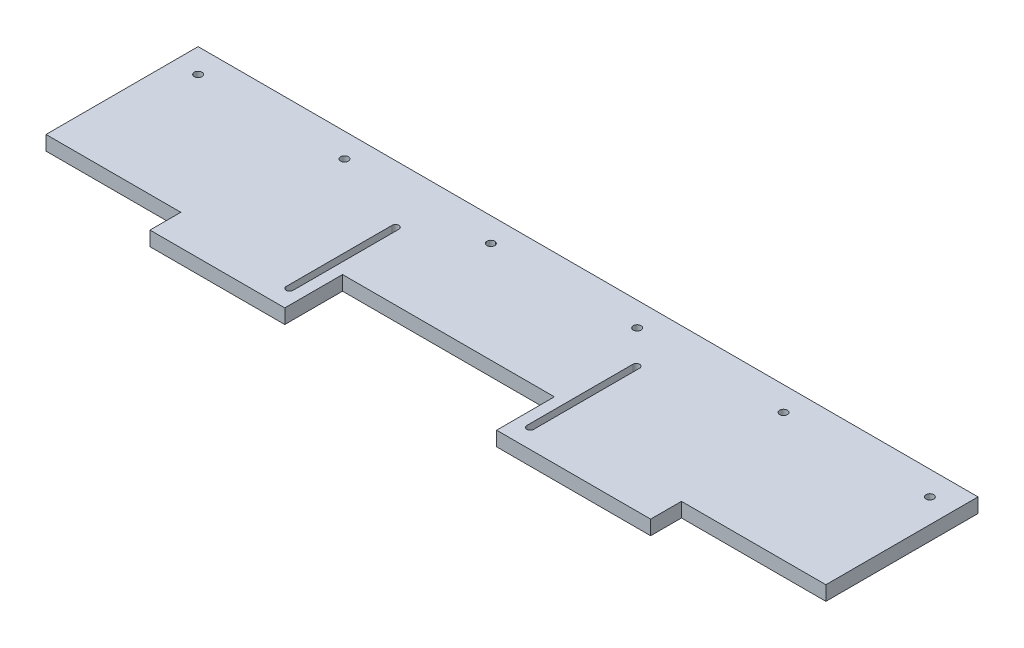
ISO-10303-21;
HEADER;
FILE_DESCRIPTION(('STEP AP214'),'2;1');
FILE_NAME('part.step','',(''),(''),'','','');
FILE_SCHEMA(('AUTOMOTIVE_DESIGN { 1 0 10303 214 1 1 1 1 }'));
ENDSEC;
DATA;
#1=APPLICATION_CONTEXT('core data for automotive mechanical design processes');
#2=APPLICATION_PROTOCOL_DEFINITION('international standard','automotive_design',2000,#1);
#3=PRODUCT_CONTEXT('',#1,'mechanical');
#4=PRODUCT('Part','Part','',(#3));
#5=PRODUCT_RELATED_PRODUCT_CATEGORY('part','',(#4));
#6=PRODUCT_DEFINITION_FORMATION('','',#4);
#7=PRODUCT_DEFINITION_CONTEXT('part definition',#1,'design');
#8=PRODUCT_DEFINITION('design','',#6,#7);
#9=PRODUCT_DEFINITION_SHAPE('','',#8);
#10=(LENGTH_UNIT() NAMED_UNIT(*) SI_UNIT(.MILLI.,.METRE.));
#11=(NAMED_UNIT(*) PLANE_ANGLE_UNIT() SI_UNIT($,.RADIAN.));
#12=(NAMED_UNIT(*) SI_UNIT($,.STERADIAN.) SOLID_ANGLE_UNIT());
#13=UNCERTAINTY_MEASURE_WITH_UNIT(LENGTH_MEASURE(1.E-05),#10,'distance_accuracy_value','');
#14=(GEOMETRIC_REPRESENTATION_CONTEXT(3) GLOBAL_UNCERTAINTY_ASSIGNED_CONTEXT((#13)) GLOBAL_UNIT_ASSIGNED_CONTEXT((#10,
#11,#12)) REPRESENTATION_CONTEXT('',''));
#15=CARTESIAN_POINT('',(0.,0.,0.));
#16=DIRECTION('',(0.,0.,1.));
#17=DIRECTION('',(1.,0.,0.));
#18=AXIS2_PLACEMENT_3D('',#15,#16,#17);
#19=CARTESIAN_POINT('',(-241.3,4.7625,-12.7));
#20=DIRECTION('',(0.,1.,0.));
#21=DIRECTION('',(0.,0.,1.));
#22=AXIS2_PLACEMENT_3D('',#19,#20,#21);
#23=CYLINDRICAL_SURFACE('',#22,2.55269999999999);
#24=CARTESIAN_POINT('',(-241.3,-4.7625,-12.7));
#25=DIRECTION('',(0.,1.,0.));
#26=DIRECTION('',(0.,0.,1.));
#27=AXIS2_PLACEMENT_3D('',#24,#25,#26);
#28=CIRCLE('',#27,2.55269999999999);
#29=CARTESIAN_POINT('',(-241.3,-4.7625,-10.1473));
#30=VERTEX_POINT('',#29);
#31=EDGE_CURVE('E108',#30,#30,#28,.T.);
#32=ORIENTED_EDGE('',*,*,#31,.F.);
#33=EDGE_LOOP('',(#32));
#34=FACE_BOUND('',#33,.T.);
#35=CARTESIAN_POINT('',(-241.3,4.7625,-12.7));
#36=DIRECTION('',(0.,1.,0.));
#37=DIRECTION('',(0.,0.,1.));
#38=AXIS2_PLACEMENT_3D('',#35,#36,#37);
#39=CIRCLE('',#38,2.55269999999999);
#40=CARTESIAN_POINT('',(-241.3,4.7625,-10.1473));
#41=VERTEX_POINT('',#40);
#42=EDGE_CURVE('E12',#41,#41,#39,.T.);
#43=ORIENTED_EDGE('',*,*,#42,.T.);
#44=EDGE_LOOP('',(#43));
#45=FACE_BOUND('',#44,.T.);
#46=ADVANCED_FACE('F100',(#34,#45),#23,.F.);
#47=CARTESIAN_POINT('',(-144.78,4.7625,-12.7));
#48=DIRECTION('',(0.,1.,0.));
#49=DIRECTION('',(0.,0.,1.));
#50=AXIS2_PLACEMENT_3D('',#47,#48,#49);
#51=CYLINDRICAL_SURFACE('',#50,2.55269999999999);
#52=CARTESIAN_POINT('',(-144.78,-4.7625,-12.7));
#53=DIRECTION('',(0.,1.,0.));
#54=DIRECTION('',(0.,0.,1.));
#55=AXIS2_PLACEMENT_3D('',#52,#53,#54);
#56=CIRCLE('',#55,2.55269999999999);
#57=CARTESIAN_POINT('',(-144.78,-4.7625,-10.1473));
#58=VERTEX_POINT('',#57);
#59=EDGE_CURVE('E487',#58,#58,#56,.T.);
#60=ORIENTED_EDGE('',*,*,#59,.F.);
#61=EDGE_LOOP('',(#60));
#62=FACE_BOUND('',#61,.T.);
#63=CARTESIAN_POINT('',(-144.78,4.7625,-12.7));
#64=DIRECTION('',(0.,1.,0.));
#65=DIRECTION('',(0.,0.,1.));
#66=AXIS2_PLACEMENT_3D('',#63,#64,#65);
#67=CIRCLE('',#66,2.55269999999999);
#68=CARTESIAN_POINT('',(-144.78,4.7625,-10.1473));
#69=VERTEX_POINT('',#68);
#70=EDGE_CURVE('E491',#69,#69,#67,.T.);
#71=ORIENTED_EDGE('',*,*,#70,.T.);
#72=EDGE_LOOP('',(#71));
#73=FACE_BOUND('',#72,.T.);
#74=ADVANCED_FACE('F501',(#62,#73),#51,.F.);
#75=CARTESIAN_POINT('',(-48.26,4.7625,-12.7));
#76=DIRECTION('',(0.,1.,0.));
#77=DIRECTION('',(0.,0.,1.));
#78=AXIS2_PLACEMENT_3D('',#75,#76,#77);
#79=CYLINDRICAL_SURFACE('',#78,2.55269999999999);
#80=CARTESIAN_POINT('',(-48.26,-4.7625,-12.7));
#81=DIRECTION('',(0.,1.,0.));
#82=DIRECTION('',(0.,0.,1.));
#83=AXIS2_PLACEMENT_3D('',#80,#81,#82);
#84=CIRCLE('',#83,2.55269999999999);
#85=CARTESIAN_POINT('',(-48.26,-4.7625,-10.1473));
#86=VERTEX_POINT('',#85);
#87=EDGE_CURVE('E479',#86,#86,#84,.T.);
#88=ORIENTED_EDGE('',*,*,#87,.F.);
#89=EDGE_LOOP('',(#88));
#90=FACE_BOUND('',#89,.T.);
#91=CARTESIAN_POINT('',(-48.26,4.7625,-12.7));
#92=DIRECTION('',(0.,1.,0.));
#93=DIRECTION('',(0.,0.,1.));
#94=AXIS2_PLACEMENT_3D('',#91,#92,#93);
#95=CIRCLE('',#94,2.55269999999999);
#96=CARTESIAN_POINT('',(-48.26,4.7625,-10.1473));
#97=VERTEX_POINT('',#96);
#98=EDGE_CURVE('E483',#97,#97,#95,.T.);
#99=ORIENTED_EDGE('',*,*,#98,.T.);
#100=EDGE_LOOP('',(#99));
#101=FACE_BOUND('',#100,.T.);
#102=ADVANCED_FACE('F525',(#90,#101),#79,.F.);
#103=CARTESIAN_POINT('',(48.26,4.7625,-12.7));
#104=DIRECTION('',(0.,1.,0.));
#105=DIRECTION('',(0.,0.,1.));
#106=AXIS2_PLACEMENT_3D('',#103,#104,#105);
#107=CYLINDRICAL_SURFACE('',#106,2.55269999999999);
#108=CARTESIAN_POINT('',(48.26,-4.7625,-12.7));
#109=DIRECTION('',(0.,1.,0.));
#110=DIRECTION('',(0.,0.,1.));
#111=AXIS2_PLACEMENT_3D('',#108,#109,#110);
#112=CIRCLE('',#111,2.55269999999999);
#113=CARTESIAN_POINT('',(48.26,-4.7625,-10.1473));
#114=VERTEX_POINT('',#113);
#115=EDGE_CURVE('E469',#114,#114,#112,.T.);
#116=ORIENTED_EDGE('',*,*,#115,.F.);
#117=EDGE_LOOP('',(#116));
#118=FACE_BOUND('',#117,.T.);
#119=CARTESIAN_POINT('',(48.26,4.7625,-12.7));
#120=DIRECTION('',(0.,1.,0.));
#121=DIRECTION('',(0.,0.,1.));
#122=AXIS2_PLACEMENT_3D('',#119,#120,#121);
#123=CIRCLE('',#122,2.55269999999999);
#124=CARTESIAN_POINT('',(48.26,4.7625,-10.1473));
#125=VERTEX_POINT('',#124);
#126=EDGE_CURVE('E475',#125,#125,#123,.T.);
#127=ORIENTED_EDGE('',*,*,#126,.T.);
#128=EDGE_LOOP('',(#127));
#129=FACE_BOUND('',#128,.T.);
#130=ADVANCED_FACE('F516',(#118,#129),#107,.F.);
#131=CARTESIAN_POINT('',(0.,4.7625,-28.575));
#132=DIRECTION('',(0.,0.,-1.));
#133=DIRECTION('',(-1.,0.,0.));
#134=AXIS2_PLACEMENT_3D('',#131,#132,#133);
#135=PLANE('',#134);
#136=DIRECTION('',(1.,0.,0.));
#137=VECTOR('',#136,1.);
#138=CARTESIAN_POINT('',(0.,-4.7625,-28.575));
#139=LINE('',#138,#137);
#140=CARTESIAN_POINT('',(-257.175,-4.7625,-28.575));
#141=VERTEX_POINT('',#140);
#142=CARTESIAN_POINT('',(257.175,-4.7625,-28.575));
#143=VERTEX_POINT('',#142);
#144=EDGE_CURVE('E430',#141,#143,#139,.T.);
#145=ORIENTED_EDGE('',*,*,#144,.F.);
#146=DIRECTION('',(0.,-1.,0.));
#147=VECTOR('',#146,1.);
#148=CARTESIAN_POINT('',(-257.175,4.7625,-28.575));
#149=LINE('',#148,#147);
#150=CARTESIAN_POINT('',(-257.175,4.7625,-28.575));
#151=VERTEX_POINT('',#150);
#152=EDGE_CURVE('E360',#151,#141,#149,.T.);
#153=ORIENTED_EDGE('',*,*,#152,.F.);
#154=DIRECTION('',(1.,0.,0.));
#155=VECTOR('',#154,1.);
#156=CARTESIAN_POINT('',(0.,4.7625,-28.575));
#157=LINE('',#156,#155);
#158=CARTESIAN_POINT('',(257.175,4.7625,-28.575));
#159=VERTEX_POINT('',#158);
#160=EDGE_CURVE('E466',#151,#159,#157,.T.);
#161=ORIENTED_EDGE('',*,*,#160,.T.);
#162=DIRECTION('',(0.,-1.,0.));
#163=VECTOR('',#162,1.);
#164=CARTESIAN_POINT('',(257.175,4.7625,-28.575));
#165=LINE('',#164,#163);
#166=EDGE_CURVE('E344',#159,#143,#165,.T.);
#167=ORIENTED_EDGE('',*,*,#166,.T.);
#168=EDGE_LOOP('',(#145,#153,#161,#167));
#169=FACE_BOUND('',#168,.T.);
#170=ADVANCED_FACE('F506',(#169),#135,.T.);
#171=CARTESIAN_POINT('',(0.,4.7625,0.));
#172=DIRECTION('',(0.,1.,0.));
#173=DIRECTION('',(0.,0.,1.));
#174=AXIS2_PLACEMENT_3D('',#171,#172,#173);
#175=PLANE('',#174);
#176=CARTESIAN_POINT('',(-88.9,4.7625,79.375));
#177=DIRECTION('',(0.,1.,0.));
#178=DIRECTION('',(0.,0.,1.));
#179=AXIS2_PLACEMENT_3D('',#176,#177,#178);
#180=CIRCLE('',#179,2.2479);
#181=CARTESIAN_POINT('',(-91.1479,4.7625,79.375));
#182=VERTEX_POINT('',#181);
#183=CARTESIAN_POINT('',(-86.6521,4.7625,79.375));
#184=VERTEX_POINT('',#183);
#185=EDGE_CURVE('E115',#182,#184,#180,.T.);
#186=ORIENTED_EDGE('',*,*,#185,.F.);
#187=DIRECTION('',(0.,0.,1.));
#188=VECTOR('',#187,1.);
#189=CARTESIAN_POINT('',(-91.1479,4.7625,79.375));
#190=LINE('',#189,#188);
#191=CARTESIAN_POINT('',(-91.1479,4.7625,9.52500000000002));
#192=VERTEX_POINT('',#191);
#193=EDGE_CURVE('E246',#192,#182,#190,.T.);
#194=ORIENTED_EDGE('',*,*,#193,.F.);
#195=CARTESIAN_POINT('',(-88.9,4.7625,9.52500000000002));
#196=DIRECTION('',(0.,1.,0.));
#197=DIRECTION('',(0.,0.,1.));
#198=AXIS2_PLACEMENT_3D('',#195,#196,#197);
#199=CIRCLE('',#198,2.2479);
#200=CARTESIAN_POINT('',(-86.6521,4.7625,9.52500000000002));
#201=VERTEX_POINT('',#200);
#202=EDGE_CURVE('E274',#201,#192,#199,.T.);
#203=ORIENTED_EDGE('',*,*,#202,.F.);
#204=DIRECTION('',(0.,0.,-1.));
#205=VECTOR('',#204,1.);
#206=CARTESIAN_POINT('',(-86.6521,4.7625,79.375));
#207=LINE('',#206,#205);
#208=EDGE_CURVE('E266',#184,#201,#207,.T.);
#209=ORIENTED_EDGE('',*,*,#208,.F.);
#210=EDGE_LOOP('',(#186,#194,#203,#209));
#211=FACE_BOUND('',#210,.T.);
#212=CARTESIAN_POINT('',(69.85,4.7625,79.375));
#213=DIRECTION('',(0.,1.,0.));
#214=DIRECTION('',(0.,0.,1.));
#215=AXIS2_PLACEMENT_3D('',#212,#213,#214);
#216=CIRCLE('',#215,2.2479);
#217=CARTESIAN_POINT('',(67.6021,4.7625,79.375));
#218=VERTEX_POINT('',#217);
#219=CARTESIAN_POINT('',(72.0979,4.7625,79.375));
#220=VERTEX_POINT('',#219);
#221=EDGE_CURVE('E123',#218,#220,#216,.T.);
#222=ORIENTED_EDGE('',*,*,#221,.F.);
#223=DIRECTION('',(0.,0.,1.));
#224=VECTOR('',#223,1.);
#225=CARTESIAN_POINT('',(67.6021,4.7625,79.375));
#226=LINE('',#225,#224);
#227=CARTESIAN_POINT('',(67.6021,4.7625,9.52499999999999));
#228=VERTEX_POINT('',#227);
#229=EDGE_CURVE('E309',#228,#218,#226,.T.);
#230=ORIENTED_EDGE('',*,*,#229,.F.);
#231=CARTESIAN_POINT('',(69.85,4.7625,9.52499999999999));
#232=DIRECTION('',(0.,1.,0.));
#233=DIRECTION('',(0.,0.,1.));
#234=AXIS2_PLACEMENT_3D('',#231,#232,#233);
#235=CIRCLE('',#234,2.2479);
#236=CARTESIAN_POINT('',(72.0979,4.7625,9.52499999999999));
#237=VERTEX_POINT('',#236);
#238=EDGE_CURVE('E305',#237,#228,#235,.T.);
#239=ORIENTED_EDGE('',*,*,#238,.F.);
#240=DIRECTION('',(0.,0.,-1.));
#241=VECTOR('',#240,1.);
#242=CARTESIAN_POINT('',(72.0979,4.7625,79.375));
#243=LINE('',#242,#241);
#244=EDGE_CURVE('E301',#220,#237,#243,.T.);
#245=ORIENTED_EDGE('',*,*,#244,.F.);
#246=EDGE_LOOP('',(#222,#230,#239,#245));
#247=FACE_BOUND('',#246,.T.);
#248=CARTESIAN_POINT('',(144.78,4.7625,-12.7));
#249=DIRECTION('',(0.,1.,0.));
#250=DIRECTION('',(0.,0.,1.));
#251=AXIS2_PLACEMENT_3D('',#248,#249,#250);
#252=CIRCLE('',#251,2.55269999999999);
#253=CARTESIAN_POINT('',(144.78,4.7625,-10.1473));
#254=VERTEX_POINT('',#253);
#255=EDGE_CURVE('E332',#254,#254,#252,.T.);
#256=ORIENTED_EDGE('',*,*,#255,.F.);
#257=EDGE_LOOP('',(#256));
#258=FACE_BOUND('',#257,.T.);
#259=CARTESIAN_POINT('',(241.3,4.7625,-12.7));
#260=DIRECTION('',(0.,1.,0.));
#261=DIRECTION('',(0.,0.,1.));
#262=AXIS2_PLACEMENT_3D('',#259,#260,#261);
#263=CIRCLE('',#262,2.55269999999999);
#264=CARTESIAN_POINT('',(241.3,4.7625,-10.1473));
#265=VERTEX_POINT('',#264);
#266=EDGE_CURVE('E336',#265,#265,#263,.T.);
#267=ORIENTED_EDGE('',*,*,#266,.F.);
#268=EDGE_LOOP('',(#267));
#269=FACE_BOUND('',#268,.T.);
#270=ORIENTED_EDGE('',*,*,#160,.F.);
#271=DIRECTION('',(0.,0.,-1.));
#272=VECTOR('',#271,1.);
#273=CARTESIAN_POINT('',(-257.175,4.7625,71.755));
#274=LINE('',#273,#272);
#275=CARTESIAN_POINT('',(-257.175,4.7625,71.755));
#276=VERTEX_POINT('',#275);
#277=EDGE_CURVE('E372',#276,#151,#274,.T.);
#278=ORIENTED_EDGE('',*,*,#277,.F.);
#279=DIRECTION('',(-1.,0.,0.));
#280=VECTOR('',#279,1.);
#281=CARTESIAN_POINT('',(0.,4.7625,71.755));
#282=LINE('',#281,#280);
#283=CARTESIAN_POINT('',(-168.275,4.7625,71.755));
#284=VERTEX_POINT('',#283);
#285=EDGE_CURVE('E377',#284,#276,#282,.T.);
#286=ORIENTED_EDGE('',*,*,#285,.F.);
#287=DIRECTION('',(0.,0.,1.));
#288=VECTOR('',#287,1.);
#289=CARTESIAN_POINT('',(-168.275,4.7625,0.));
#290=LINE('',#289,#288);
#291=CARTESIAN_POINT('',(-168.275,4.7625,92.075));
#292=VERTEX_POINT('',#291);
#293=EDGE_CURVE('E380',#284,#292,#290,.T.);
#294=ORIENTED_EDGE('',*,*,#293,.T.);
#295=DIRECTION('',(-1.,0.,0.));
#296=VECTOR('',#295,1.);
#297=CARTESIAN_POINT('',(0.,4.7625,92.075));
#298=LINE('',#297,#296);
#299=CARTESIAN_POINT('',(-79.375,4.7625,92.075));
#300=VERTEX_POINT('',#299);
#301=EDGE_CURVE('E384',#300,#292,#298,.T.);
#302=ORIENTED_EDGE('',*,*,#301,.F.);
#303=DIRECTION('',(0.,0.,1.));
#304=VECTOR('',#303,1.);
#305=CARTESIAN_POINT('',(-79.375,4.7625,0.));
#306=LINE('',#305,#304);
#307=CARTESIAN_POINT('',(-79.375,4.7625,53.975));
#308=VERTEX_POINT('',#307);
#309=EDGE_CURVE('E388',#308,#300,#306,.T.);
#310=ORIENTED_EDGE('',*,*,#309,.F.);
#311=DIRECTION('',(1.,0.,0.));
#312=VECTOR('',#311,1.);
#313=CARTESIAN_POINT('',(0.,4.7625,53.975));
#314=LINE('',#313,#312);
#315=CARTESIAN_POINT('',(60.325,4.7625,53.975));
#316=VERTEX_POINT('',#315);
#317=EDGE_CURVE('E392',#308,#316,#314,.T.);
#318=ORIENTED_EDGE('',*,*,#317,.T.);
#319=DIRECTION('',(0.,0.,1.));
#320=VECTOR('',#319,1.);
#321=CARTESIAN_POINT('',(60.325,4.7625,28.575));
#322=LINE('',#321,#320);
#323=CARTESIAN_POINT('',(60.325,4.7625,92.075));
#324=VERTEX_POINT('',#323);
#325=EDGE_CURVE('E440',#316,#324,#322,.T.);
#326=ORIENTED_EDGE('',*,*,#325,.T.);
#327=DIRECTION('',(-1.,0.,0.));
#328=VECTOR('',#327,1.);
#329=CARTESIAN_POINT('',(161.925,4.7625,92.075));
#330=LINE('',#329,#328);
#331=CARTESIAN_POINT('',(161.925,4.7625,92.075));
#332=VERTEX_POINT('',#331);
#333=EDGE_CURVE('E443',#332,#324,#330,.T.);
#334=ORIENTED_EDGE('',*,*,#333,.F.);
#335=DIRECTION('',(0.,0.,1.));
#336=VECTOR('',#335,1.);
#337=CARTESIAN_POINT('',(161.925,4.7625,28.575));
#338=LINE('',#337,#336);
#339=CARTESIAN_POINT('',(161.925,4.7625,71.755));
#340=VERTEX_POINT('',#339);
#341=EDGE_CURVE('E448',#340,#332,#338,.T.);
#342=ORIENTED_EDGE('',*,*,#341,.F.);
#343=DIRECTION('',(1.,0.,0.));
#344=VECTOR('',#343,1.);
#345=CARTESIAN_POINT('',(0.,4.7625,71.755));
#346=LINE('',#345,#344);
#347=CARTESIAN_POINT('',(257.175,4.7625,71.755));
#348=VERTEX_POINT('',#347);
#349=EDGE_CURVE('E431',#340,#348,#346,.T.);
#350=ORIENTED_EDGE('',*,*,#349,.T.);
#351=DIRECTION('',(0.,0.,-1.));
#352=VECTOR('',#351,1.);
#353=CARTESIAN_POINT('',(257.175,4.7625,71.755));
#354=LINE('',#353,#352);
#355=EDGE_CURVE('E348',#348,#159,#354,.T.);
#356=ORIENTED_EDGE('',*,*,#355,.T.);
#357=EDGE_LOOP('',(#270,#278,#286,#294,#302,#310,#318,#326,#334,#342,#350,#356));
#358=FACE_BOUND('',#357,.T.);
#359=ORIENTED_EDGE('',*,*,#126,.F.);
#360=EDGE_LOOP('',(#359));
#361=FACE_BOUND('',#360,.T.);
#362=ORIENTED_EDGE('',*,*,#98,.F.);
#363=EDGE_LOOP('',(#362));
#364=FACE_BOUND('',#363,.T.);
#365=ORIENTED_EDGE('',*,*,#70,.F.);
#366=EDGE_LOOP('',(#365));
#367=FACE_BOUND('',#366,.T.);
#368=ORIENTED_EDGE('',*,*,#42,.F.);
#369=EDGE_LOOP('',(#368));
#370=FACE_BOUND('',#369,.T.);
#371=ADVANCED_FACE('F504',(#211,#247,#258,#269,#358,#361,#364,#367,#370),#175,.T.);
#372=CARTESIAN_POINT('',(0.,-4.7625,0.));
#373=DIRECTION('',(0.,1.,0.));
#374=DIRECTION('',(0.,0.,1.));
#375=AXIS2_PLACEMENT_3D('',#372,#373,#374);
#376=PLANE('',#375);
#377=DIRECTION('',(0.,0.,-1.));
#378=VECTOR('',#377,1.);
#379=CARTESIAN_POINT('',(-91.1479,-4.7625,79.375));
#380=LINE('',#379,#378);
#381=CARTESIAN_POINT('',(-91.1479,-4.7625,79.375));
#382=VERTEX_POINT('',#381);
#383=CARTESIAN_POINT('',(-91.1479,-4.7625,9.52500000000002));
#384=VERTEX_POINT('',#383);
#385=EDGE_CURVE('E261',#382,#384,#380,.T.);
#386=ORIENTED_EDGE('',*,*,#385,.F.);
#387=CARTESIAN_POINT('',(-88.9,-4.7625,79.375));
#388=DIRECTION('',(0.,1.,0.));
#389=DIRECTION('',(0.,0.,1.));
#390=AXIS2_PLACEMENT_3D('',#387,#388,#389);
#391=CIRCLE('',#390,2.2479);
#392=CARTESIAN_POINT('',(-86.6521,-4.7625,79.375));
#393=VERTEX_POINT('',#392);
#394=EDGE_CURVE('E239',#393,#382,#391,.F.);
#395=ORIENTED_EDGE('',*,*,#394,.F.);
#396=DIRECTION('',(0.,0.,1.));
#397=VECTOR('',#396,1.);
#398=CARTESIAN_POINT('',(-86.6521,-4.7625,79.375));
#399=LINE('',#398,#397);
#400=CARTESIAN_POINT('',(-86.6521,-4.7625,9.52500000000002));
#401=VERTEX_POINT('',#400);
#402=EDGE_CURVE('E250',#401,#393,#399,.T.);
#403=ORIENTED_EDGE('',*,*,#402,.F.);
#404=CARTESIAN_POINT('',(-88.9,-4.7625,9.52500000000002));
#405=DIRECTION('',(0.,1.,0.));
#406=DIRECTION('',(0.,0.,1.));
#407=AXIS2_PLACEMENT_3D('',#404,#405,#406);
#408=CIRCLE('',#407,2.2479);
#409=EDGE_CURVE('E268',#384,#401,#408,.F.);
#410=ORIENTED_EDGE('',*,*,#409,.F.);
#411=EDGE_LOOP('',(#386,#395,#403,#410));
#412=FACE_BOUND('',#411,.T.);
#413=DIRECTION('',(0.,0.,-1.));
#414=VECTOR('',#413,1.);
#415=CARTESIAN_POINT('',(67.6021,-4.7625,79.375));
#416=LINE('',#415,#414);
#417=CARTESIAN_POINT('',(67.6021,-4.7625,79.375));
#418=VERTEX_POINT('',#417);
#419=CARTESIAN_POINT('',(67.6021,-4.7625,9.52499999999999));
#420=VERTEX_POINT('',#419);
#421=EDGE_CURVE('E291',#418,#420,#416,.T.);
#422=ORIENTED_EDGE('',*,*,#421,.F.);
#423=CARTESIAN_POINT('',(69.85,-4.7625,79.375));
#424=DIRECTION('',(0.,1.,0.));
#425=DIRECTION('',(0.,0.,1.));
#426=AXIS2_PLACEMENT_3D('',#423,#424,#425);
#427=CIRCLE('',#426,2.2479);
#428=CARTESIAN_POINT('',(72.0979,-4.7625,79.375));
#429=VERTEX_POINT('',#428);
#430=EDGE_CURVE('E295',#429,#418,#427,.F.);
#431=ORIENTED_EDGE('',*,*,#430,.F.);
#432=DIRECTION('',(0.,0.,1.));
#433=VECTOR('',#432,1.);
#434=CARTESIAN_POINT('',(72.0979,-4.7625,79.375));
#435=LINE('',#434,#433);
#436=CARTESIAN_POINT('',(72.0979,-4.7625,9.52499999999999));
#437=VERTEX_POINT('',#436);
#438=EDGE_CURVE('E317',#437,#429,#435,.T.);
#439=ORIENTED_EDGE('',*,*,#438,.F.);
#440=CARTESIAN_POINT('',(69.85,-4.7625,9.52499999999999));
#441=DIRECTION('',(0.,1.,0.));
#442=DIRECTION('',(0.,0.,1.));
#443=AXIS2_PLACEMENT_3D('',#440,#441,#442);
#444=CIRCLE('',#443,2.2479);
#445=EDGE_CURVE('E288',#420,#437,#444,.F.);
#446=ORIENTED_EDGE('',*,*,#445,.F.);
#447=EDGE_LOOP('',(#422,#431,#439,#446));
#448=FACE_BOUND('',#447,.T.);
#449=CARTESIAN_POINT('',(144.78,-4.7625,-12.7));
#450=DIRECTION('',(0.,1.,0.));
#451=DIRECTION('',(0.,0.,1.));
#452=AXIS2_PLACEMENT_3D('',#449,#450,#451);
#453=CIRCLE('',#452,2.55269999999999);
#454=CARTESIAN_POINT('',(144.78,-4.7625,-10.1473));
#455=VERTEX_POINT('',#454);
#456=EDGE_CURVE('E255',#455,#455,#453,.T.);
#457=ORIENTED_EDGE('',*,*,#456,.T.);
#458=EDGE_LOOP('',(#457));
#459=FACE_BOUND('',#458,.T.);
#460=CARTESIAN_POINT('',(241.3,-4.7625,-12.7));
#461=DIRECTION('',(0.,1.,0.));
#462=DIRECTION('',(0.,0.,1.));
#463=AXIS2_PLACEMENT_3D('',#460,#461,#462);
#464=CIRCLE('',#463,2.55269999999999);
#465=CARTESIAN_POINT('',(241.3,-4.7625,-10.1473));
#466=VERTEX_POINT('',#465);
#467=EDGE_CURVE('E340',#466,#466,#464,.T.);
#468=ORIENTED_EDGE('',*,*,#467,.T.);
#469=EDGE_LOOP('',(#468));
#470=FACE_BOUND('',#469,.T.);
#471=ORIENTED_EDGE('',*,*,#144,.T.);
#472=DIRECTION('',(0.,0.,1.));
#473=VECTOR('',#472,1.);
#474=CARTESIAN_POINT('',(257.175,-4.7625,-28.575));
#475=LINE('',#474,#473);
#476=CARTESIAN_POINT('',(257.175,-4.7625,71.755));
#477=VERTEX_POINT('',#476);
#478=EDGE_CURVE('E356',#143,#477,#475,.T.);
#479=ORIENTED_EDGE('',*,*,#478,.T.);
#480=DIRECTION('',(1.,0.,0.));
#481=VECTOR('',#480,1.);
#482=CARTESIAN_POINT('',(0.,-4.7625,71.755));
#483=LINE('',#482,#481);
#484=CARTESIAN_POINT('',(161.925,-4.7625,71.755));
#485=VERTEX_POINT('',#484);
#486=EDGE_CURVE('E434',#485,#477,#483,.T.);
#487=ORIENTED_EDGE('',*,*,#486,.F.);
#488=DIRECTION('',(0.,0.,1.));
#489=VECTOR('',#488,1.);
#490=CARTESIAN_POINT('',(161.925,-4.7625,28.575));
#491=LINE('',#490,#489);
#492=CARTESIAN_POINT('',(161.925,-4.7625,92.075));
#493=VERTEX_POINT('',#492);
#494=EDGE_CURVE('E444',#485,#493,#491,.T.);
#495=ORIENTED_EDGE('',*,*,#494,.T.);
#496=DIRECTION('',(-1.,0.,0.));
#497=VECTOR('',#496,1.);
#498=CARTESIAN_POINT('',(161.925,-4.7625,92.075));
#499=LINE('',#498,#497);
#500=CARTESIAN_POINT('',(60.325,-4.7625,92.075));
#501=VERTEX_POINT('',#500);
#502=EDGE_CURVE('E454',#493,#501,#499,.T.);
#503=ORIENTED_EDGE('',*,*,#502,.T.);
#504=DIRECTION('',(0.,0.,1.));
#505=VECTOR('',#504,1.);
#506=CARTESIAN_POINT('',(60.325,-4.7625,28.575));
#507=LINE('',#506,#505);
#508=CARTESIAN_POINT('',(60.325,-4.7625,53.975));
#509=VERTEX_POINT('',#508);
#510=EDGE_CURVE('E376',#509,#501,#507,.T.);
#511=ORIENTED_EDGE('',*,*,#510,.F.);
#512=DIRECTION('',(1.,0.,0.));
#513=VECTOR('',#512,1.);
#514=CARTESIAN_POINT('',(0.,-4.7625,53.975));
#515=LINE('',#514,#513);
#516=CARTESIAN_POINT('',(-79.375,-4.7625,53.975));
#517=VERTEX_POINT('',#516);
#518=EDGE_CURVE('E381',#517,#509,#515,.T.);
#519=ORIENTED_EDGE('',*,*,#518,.F.);
#520=DIRECTION('',(0.,0.,1.));
#521=VECTOR('',#520,1.);
#522=CARTESIAN_POINT('',(-79.375,-4.7625,0.));
#523=LINE('',#522,#521);
#524=CARTESIAN_POINT('',(-79.375,-4.7625,92.075));
#525=VERTEX_POINT('',#524);
#526=EDGE_CURVE('E409',#517,#525,#523,.T.);
#527=ORIENTED_EDGE('',*,*,#526,.T.);
#528=DIRECTION('',(-1.,0.,0.));
#529=VECTOR('',#528,1.);
#530=CARTESIAN_POINT('',(0.,-4.7625,92.075));
#531=LINE('',#530,#529);
#532=CARTESIAN_POINT('',(-168.275,-4.7625,92.075));
#533=VERTEX_POINT('',#532);
#534=EDGE_CURVE('E405',#525,#533,#531,.T.);
#535=ORIENTED_EDGE('',*,*,#534,.T.);
#536=DIRECTION('',(0.,0.,1.));
#537=VECTOR('',#536,1.);
#538=CARTESIAN_POINT('',(-168.275,-4.7625,0.));
#539=LINE('',#538,#537);
#540=CARTESIAN_POINT('',(-168.275,-4.7625,71.755));
#541=VERTEX_POINT('',#540);
#542=EDGE_CURVE('E400',#541,#533,#539,.T.);
#543=ORIENTED_EDGE('',*,*,#542,.F.);
#544=DIRECTION('',(-1.,0.,0.));
#545=VECTOR('',#544,1.);
#546=CARTESIAN_POINT('',(0.,-4.7625,71.755));
#547=LINE('',#546,#545);
#548=CARTESIAN_POINT('',(-257.175,-4.7625,71.755));
#549=VERTEX_POINT('',#548);
#550=EDGE_CURVE('E397',#541,#549,#547,.T.);
#551=ORIENTED_EDGE('',*,*,#550,.T.);
#552=DIRECTION('',(0.,0.,1.));
#553=VECTOR('',#552,1.);
#554=CARTESIAN_POINT('',(-257.175,-4.7625,-28.575));
#555=LINE('',#554,#553);
#556=EDGE_CURVE('E364',#141,#549,#555,.T.);
#557=ORIENTED_EDGE('',*,*,#556,.F.);
#558=EDGE_LOOP('',(#471,#479,#487,#495,#503,#511,#519,#527,#535,#543,#551,#557));
#559=FACE_BOUND('',#558,.T.);
#560=ORIENTED_EDGE('',*,*,#115,.T.);
#561=EDGE_LOOP('',(#560));
#562=FACE_BOUND('',#561,.T.);
#563=ORIENTED_EDGE('',*,*,#87,.T.);
#564=EDGE_LOOP('',(#563));
#565=FACE_BOUND('',#564,.T.);
#566=ORIENTED_EDGE('',*,*,#59,.T.);
#567=EDGE_LOOP('',(#566));
#568=FACE_BOUND('',#567,.T.);
#569=ORIENTED_EDGE('',*,*,#31,.T.);
#570=EDGE_LOOP('',(#569));
#571=FACE_BOUND('',#570,.T.);
#572=ADVANCED_FACE('F258',(#412,#448,#459,#470,#559,#562,#565,#568,#571),#376,.F.);
#573=CARTESIAN_POINT('',(0.,4.7625,71.755));
#574=DIRECTION('',(0.,0.,1.));
#575=DIRECTION('',(1.,0.,0.));
#576=AXIS2_PLACEMENT_3D('',#573,#574,#575);
#577=PLANE('',#576);
#578=ORIENTED_EDGE('',*,*,#550,.F.);
#579=DIRECTION('',(0.,-1.,0.));
#580=VECTOR('',#579,1.);
#581=CARTESIAN_POINT('',(-168.275,4.7625,71.755));
#582=LINE('',#581,#580);
#583=EDGE_CURVE('E427',#284,#541,#582,.T.);
#584=ORIENTED_EDGE('',*,*,#583,.F.);
#585=ORIENTED_EDGE('',*,*,#285,.T.);
#586=DIRECTION('',(0.,1.,0.));
#587=VECTOR('',#586,1.);
#588=CARTESIAN_POINT('',(-257.175,-4.7625,71.755));
#589=LINE('',#588,#587);
#590=EDGE_CURVE('E368',#549,#276,#589,.T.);
#591=ORIENTED_EDGE('',*,*,#590,.F.);
#592=EDGE_LOOP('',(#578,#584,#585,#591));
#593=FACE_BOUND('',#592,.T.);
#594=ADVANCED_FACE('F513',(#593),#577,.T.);
#595=CARTESIAN_POINT('',(-168.275,4.7625,0.));
#596=DIRECTION('',(1.,0.,0.));
#597=DIRECTION('',(0.,0.,-1.));
#598=AXIS2_PLACEMENT_3D('',#595,#596,#597);
#599=PLANE('',#598);
#600=ORIENTED_EDGE('',*,*,#542,.T.);
#601=DIRECTION('',(0.,-1.,0.));
#602=VECTOR('',#601,1.);
#603=CARTESIAN_POINT('',(-168.275,4.7625,92.075));
#604=LINE('',#603,#602);
#605=EDGE_CURVE('E424',#292,#533,#604,.T.);
#606=ORIENTED_EDGE('',*,*,#605,.F.);
#607=ORIENTED_EDGE('',*,*,#293,.F.);
#608=ORIENTED_EDGE('',*,*,#583,.T.);
#609=EDGE_LOOP('',(#600,#606,#607,#608));
#610=FACE_BOUND('',#609,.T.);
#611=ADVANCED_FACE('F708',(#610),#599,.F.);
#612=CARTESIAN_POINT('',(0.,4.7625,92.075));
#613=DIRECTION('',(0.,0.,1.));
#614=DIRECTION('',(1.,0.,0.));
#615=AXIS2_PLACEMENT_3D('',#612,#613,#614);
#616=PLANE('',#615);
#617=ORIENTED_EDGE('',*,*,#534,.F.);
#618=DIRECTION('',(0.,-1.,0.));
#619=VECTOR('',#618,1.);
#620=CARTESIAN_POINT('',(-79.375,4.7625,92.075));
#621=LINE('',#620,#619);
#622=EDGE_CURVE('E421',#300,#525,#621,.T.);
#623=ORIENTED_EDGE('',*,*,#622,.F.);
#624=ORIENTED_EDGE('',*,*,#301,.T.);
#625=ORIENTED_EDGE('',*,*,#605,.T.);
#626=EDGE_LOOP('',(#617,#623,#624,#625));
#627=FACE_BOUND('',#626,.T.);
#628=ADVANCED_FACE('F704',(#627),#616,.T.);
#629=CARTESIAN_POINT('',(-79.375,4.7625,0.));
#630=DIRECTION('',(1.,0.,0.));
#631=DIRECTION('',(0.,0.,-1.));
#632=AXIS2_PLACEMENT_3D('',#629,#630,#631);
#633=PLANE('',#632);
#634=ORIENTED_EDGE('',*,*,#526,.F.);
#635=DIRECTION('',(0.,-1.,0.));
#636=VECTOR('',#635,1.);
#637=CARTESIAN_POINT('',(-79.375,4.7625,53.975));
#638=LINE('',#637,#636);
#639=EDGE_CURVE('E418',#308,#517,#638,.T.);
#640=ORIENTED_EDGE('',*,*,#639,.F.);
#641=ORIENTED_EDGE('',*,*,#309,.T.);
#642=ORIENTED_EDGE('',*,*,#622,.T.);
#643=EDGE_LOOP('',(#634,#640,#641,#642));
#644=FACE_BOUND('',#643,.T.);
#645=ADVANCED_FACE('F700',(#644),#633,.T.);
#646=CARTESIAN_POINT('',(0.,4.7625,53.975));
#647=DIRECTION('',(0.,0.,-1.));
#648=DIRECTION('',(-1.,0.,0.));
#649=AXIS2_PLACEMENT_3D('',#646,#647,#648);
#650=PLANE('',#649);
#651=ORIENTED_EDGE('',*,*,#518,.T.);
#652=DIRECTION('',(0.,-1.,0.));
#653=VECTOR('',#652,1.);
#654=CARTESIAN_POINT('',(60.325,4.7625,53.975));
#655=LINE('',#654,#653);
#656=EDGE_CURVE('E396',#316,#509,#655,.T.);
#657=ORIENTED_EDGE('',*,*,#656,.F.);
#658=ORIENTED_EDGE('',*,*,#317,.F.);
#659=ORIENTED_EDGE('',*,*,#639,.T.);
#660=EDGE_LOOP('',(#651,#657,#658,#659));
#661=FACE_BOUND('',#660,.T.);
#662=ADVANCED_FACE('F572',(#661),#650,.F.);
#663=CARTESIAN_POINT('',(0.,4.7625,71.755));
#664=DIRECTION('',(0.,0.,-1.));
#665=DIRECTION('',(-1.,0.,0.));
#666=AXIS2_PLACEMENT_3D('',#663,#664,#665);
#667=PLANE('',#666);
#668=ORIENTED_EDGE('',*,*,#486,.T.);
#669=DIRECTION('',(0.,1.,0.));
#670=VECTOR('',#669,1.);
#671=CARTESIAN_POINT('',(257.175,-4.7625,71.755));
#672=LINE('',#671,#670);
#673=EDGE_CURVE('E352',#477,#348,#672,.T.);
#674=ORIENTED_EDGE('',*,*,#673,.T.);
#675=ORIENTED_EDGE('',*,*,#349,.F.);
#676=DIRECTION('',(0.,-1.,0.));
#677=VECTOR('',#676,1.);
#678=CARTESIAN_POINT('',(161.925,4.7625,71.755));
#679=LINE('',#678,#677);
#680=EDGE_CURVE('E401',#340,#485,#679,.T.);
#681=ORIENTED_EDGE('',*,*,#680,.T.);
#682=EDGE_LOOP('',(#668,#674,#675,#681));
#683=FACE_BOUND('',#682,.T.);
#684=ADVANCED_FACE('F566',(#683),#667,.F.);
#685=CARTESIAN_POINT('',(161.925,4.7625,28.575));
#686=DIRECTION('',(1.,0.,0.));
#687=DIRECTION('',(0.,0.,-1.));
#688=AXIS2_PLACEMENT_3D('',#685,#686,#687);
#689=PLANE('',#688);
#690=ORIENTED_EDGE('',*,*,#680,.F.);
#691=ORIENTED_EDGE('',*,*,#341,.T.);
#692=DIRECTION('',(0.,-1.,0.));
#693=VECTOR('',#692,1.);
#694=CARTESIAN_POINT('',(161.925,4.7625,92.075));
#695=LINE('',#694,#693);
#696=EDGE_CURVE('E451',#332,#493,#695,.T.);
#697=ORIENTED_EDGE('',*,*,#696,.T.);
#698=ORIENTED_EDGE('',*,*,#494,.F.);
#699=EDGE_LOOP('',(#690,#691,#697,#698));
#700=FACE_BOUND('',#699,.T.);
#701=ADVANCED_FACE('F571',(#700),#689,.T.);
#702=CARTESIAN_POINT('',(161.925,4.7625,92.075));
#703=DIRECTION('',(0.,0.,1.));
#704=DIRECTION('',(1.,0.,0.));
#705=AXIS2_PLACEMENT_3D('',#702,#703,#704);
#706=PLANE('',#705);
#707=ORIENTED_EDGE('',*,*,#502,.F.);
#708=ORIENTED_EDGE('',*,*,#696,.F.);
#709=ORIENTED_EDGE('',*,*,#333,.T.);
#710=DIRECTION('',(0.,-1.,0.));
#711=VECTOR('',#710,1.);
#712=CARTESIAN_POINT('',(60.325,4.7625,92.075));
#713=LINE('',#712,#711);
#714=EDGE_CURVE('E437',#324,#501,#713,.T.);
#715=ORIENTED_EDGE('',*,*,#714,.T.);
#716=EDGE_LOOP('',(#707,#708,#709,#715));
#717=FACE_BOUND('',#716,.T.);
#718=ADVANCED_FACE('F715',(#717),#706,.T.);
#719=CARTESIAN_POINT('',(60.325,4.7625,28.575));
#720=DIRECTION('',(1.,0.,0.));
#721=DIRECTION('',(0.,0.,-1.));
#722=AXIS2_PLACEMENT_3D('',#719,#720,#721);
#723=PLANE('',#722);
#724=ORIENTED_EDGE('',*,*,#325,.F.);
#725=ORIENTED_EDGE('',*,*,#656,.T.);
#726=ORIENTED_EDGE('',*,*,#510,.T.);
#727=ORIENTED_EDGE('',*,*,#714,.F.);
#728=EDGE_LOOP('',(#724,#725,#726,#727));
#729=FACE_BOUND('',#728,.T.);
#730=ADVANCED_FACE('F515',(#729),#723,.F.);
#731=CARTESIAN_POINT('',(-257.175,0.,0.));
#732=DIRECTION('',(-1.,0.,0.));
#733=DIRECTION('',(0.,0.,1.));
#734=AXIS2_PLACEMENT_3D('',#731,#732,#733);
#735=PLANE('',#734);
#736=ORIENTED_EDGE('',*,*,#152,.T.);
#737=ORIENTED_EDGE('',*,*,#556,.T.);
#738=ORIENTED_EDGE('',*,*,#590,.T.);
#739=ORIENTED_EDGE('',*,*,#277,.T.);
#740=EDGE_LOOP('',(#736,#737,#738,#739));
#741=FACE_BOUND('',#740,.T.);
#742=ADVANCED_FACE('F562',(#741),#735,.T.);
#743=CARTESIAN_POINT('',(257.175,0.,0.));
#744=DIRECTION('',(1.,0.,0.));
#745=DIRECTION('',(0.,0.,1.));
#746=AXIS2_PLACEMENT_3D('',#743,#744,#745);
#747=PLANE('',#746);
#748=ORIENTED_EDGE('',*,*,#166,.F.);
#749=ORIENTED_EDGE('',*,*,#355,.F.);
#750=ORIENTED_EDGE('',*,*,#673,.F.);
#751=ORIENTED_EDGE('',*,*,#478,.F.);
#752=EDGE_LOOP('',(#748,#749,#750,#751));
#753=FACE_BOUND('',#752,.T.);
#754=ADVANCED_FACE('F583',(#753),#747,.T.);
#755=CARTESIAN_POINT('',(241.3,4.7625,-12.7));
#756=DIRECTION('',(0.,1.,0.));
#757=DIRECTION('',(0.,0.,1.));
#758=AXIS2_PLACEMENT_3D('',#755,#756,#757);
#759=CYLINDRICAL_SURFACE('',#758,2.55269999999999);
#760=ORIENTED_EDGE('',*,*,#467,.F.);
#761=EDGE_LOOP('',(#760));
#762=FACE_BOUND('',#761,.T.);
#763=ORIENTED_EDGE('',*,*,#266,.T.);
#764=EDGE_LOOP('',(#763));
#765=FACE_BOUND('',#764,.T.);
#766=ADVANCED_FACE('F587',(#762,#765),#759,.F.);
#767=CARTESIAN_POINT('',(144.78,4.7625,-12.7));
#768=DIRECTION('',(0.,1.,0.));
#769=DIRECTION('',(0.,0.,1.));
#770=AXIS2_PLACEMENT_3D('',#767,#768,#769);
#771=CYLINDRICAL_SURFACE('',#770,2.55269999999999);
#772=ORIENTED_EDGE('',*,*,#456,.F.);
#773=EDGE_LOOP('',(#772));
#774=FACE_BOUND('',#773,.T.);
#775=ORIENTED_EDGE('',*,*,#255,.T.);
#776=EDGE_LOOP('',(#775));
#777=FACE_BOUND('',#776,.T.);
#778=ADVANCED_FACE('F596',(#774,#777),#771,.F.);
#779=CARTESIAN_POINT('',(69.85,-4.7635,79.375));
#780=DIRECTION('',(0.,1.,0.));
#781=DIRECTION('',(0.,0.,1.));
#782=AXIS2_PLACEMENT_3D('',#779,#780,#781);
#783=CYLINDRICAL_SURFACE('',#782,2.2479);
#784=ORIENTED_EDGE('',*,*,#430,.T.);
#785=DIRECTION('',(0.,1.,0.));
#786=VECTOR('',#785,1.);
#787=CARTESIAN_POINT('',(67.6021,-4.7635,79.375));
#788=LINE('',#787,#786);
#789=EDGE_CURVE('E314',#418,#218,#788,.T.);
#790=ORIENTED_EDGE('',*,*,#789,.T.);
#791=ORIENTED_EDGE('',*,*,#221,.T.);
#792=DIRECTION('',(0.,1.,0.));
#793=VECTOR('',#792,1.);
#794=CARTESIAN_POINT('',(72.0979,-4.7635,79.375));
#795=LINE('',#794,#793);
#796=EDGE_CURVE('E313',#429,#220,#795,.T.);
#797=ORIENTED_EDGE('',*,*,#796,.F.);
#798=EDGE_LOOP('',(#784,#790,#791,#797));
#799=FACE_BOUND('',#798,.T.);
#800=ADVANCED_FACE('F617',(#799),#783,.F.);
#801=CARTESIAN_POINT('',(67.6021,-4.7635,79.375));
#802=DIRECTION('',(-1.,0.,0.));
#803=DIRECTION('',(0.,0.,1.));
#804=AXIS2_PLACEMENT_3D('',#801,#802,#803);
#805=PLANE('',#804);
#806=ORIENTED_EDGE('',*,*,#421,.T.);
#807=DIRECTION('',(0.,1.,0.));
#808=VECTOR('',#807,1.);
#809=CARTESIAN_POINT('',(67.6021,-4.7635,9.52499999999999));
#810=LINE('',#809,#808);
#811=EDGE_CURVE('E318',#420,#228,#810,.T.);
#812=ORIENTED_EDGE('',*,*,#811,.T.);
#813=ORIENTED_EDGE('',*,*,#229,.T.);
#814=ORIENTED_EDGE('',*,*,#789,.F.);
#815=EDGE_LOOP('',(#806,#812,#813,#814));
#816=FACE_BOUND('',#815,.T.);
#817=ADVANCED_FACE('F626',(#816),#805,.F.);
#818=CARTESIAN_POINT('',(69.85,-4.7635,9.52499999999999));
#819=DIRECTION('',(0.,1.,0.));
#820=DIRECTION('',(0.,0.,1.));
#821=AXIS2_PLACEMENT_3D('',#818,#819,#820);
#822=CYLINDRICAL_SURFACE('',#821,2.2479);
#823=ORIENTED_EDGE('',*,*,#445,.T.);
#824=DIRECTION('',(0.,1.,0.));
#825=VECTOR('',#824,1.);
#826=CARTESIAN_POINT('',(72.0979,-4.7635,9.52499999999999));
#827=LINE('',#826,#825);
#828=EDGE_CURVE('E321',#437,#237,#827,.T.);
#829=ORIENTED_EDGE('',*,*,#828,.T.);
#830=ORIENTED_EDGE('',*,*,#238,.T.);
#831=ORIENTED_EDGE('',*,*,#811,.F.);
#832=EDGE_LOOP('',(#823,#829,#830,#831));
#833=FACE_BOUND('',#832,.T.);
#834=ADVANCED_FACE('F635',(#833),#822,.F.);
#835=CARTESIAN_POINT('',(72.0979,-4.7635,79.375));
#836=DIRECTION('',(1.,0.,0.));
#837=DIRECTION('',(0.,0.,-1.));
#838=AXIS2_PLACEMENT_3D('',#835,#836,#837);
#839=PLANE('',#838);
#840=ORIENTED_EDGE('',*,*,#438,.T.);
#841=ORIENTED_EDGE('',*,*,#796,.T.);
#842=ORIENTED_EDGE('',*,*,#244,.T.);
#843=ORIENTED_EDGE('',*,*,#828,.F.);
#844=EDGE_LOOP('',(#840,#841,#842,#843));
#845=FACE_BOUND('',#844,.T.);
#846=ADVANCED_FACE('F644',(#845),#839,.F.);
#847=CARTESIAN_POINT('',(-88.9,-4.7635,79.375));
#848=DIRECTION('',(0.,1.,0.));
#849=DIRECTION('',(0.,0.,1.));
#850=AXIS2_PLACEMENT_3D('',#847,#848,#849);
#851=CYLINDRICAL_SURFACE('',#850,2.2479);
#852=ORIENTED_EDGE('',*,*,#394,.T.);
#853=DIRECTION('',(0.,1.,0.));
#854=VECTOR('',#853,1.);
#855=CARTESIAN_POINT('',(-91.1479,-4.7635,79.375));
#856=LINE('',#855,#854);
#857=EDGE_CURVE('E256',#382,#182,#856,.T.);
#858=ORIENTED_EDGE('',*,*,#857,.T.);
#859=ORIENTED_EDGE('',*,*,#185,.T.);
#860=DIRECTION('',(0.,1.,0.));
#861=VECTOR('',#860,1.);
#862=CARTESIAN_POINT('',(-86.6521,-4.7635,79.375));
#863=LINE('',#862,#861);
#864=EDGE_CURVE('E235',#393,#184,#863,.T.);
#865=ORIENTED_EDGE('',*,*,#864,.F.);
#866=EDGE_LOOP('',(#852,#858,#859,#865));
#867=FACE_BOUND('',#866,.T.);
#868=ADVANCED_FACE('F237',(#867),#851,.F.);
#869=CARTESIAN_POINT('',(-91.1479,-4.7635,79.375));
#870=DIRECTION('',(-1.,0.,0.));
#871=DIRECTION('',(0.,0.,1.));
#872=AXIS2_PLACEMENT_3D('',#869,#870,#871);
#873=PLANE('',#872);
#874=ORIENTED_EDGE('',*,*,#385,.T.);
#875=DIRECTION('',(0.,1.,0.));
#876=VECTOR('',#875,1.);
#877=CARTESIAN_POINT('',(-91.1479,-4.7635,9.52500000000002));
#878=LINE('',#877,#876);
#879=EDGE_CURVE('E283',#384,#192,#878,.T.);
#880=ORIENTED_EDGE('',*,*,#879,.T.);
#881=ORIENTED_EDGE('',*,*,#193,.T.);
#882=ORIENTED_EDGE('',*,*,#857,.F.);
#883=EDGE_LOOP('',(#874,#880,#881,#882));
#884=FACE_BOUND('',#883,.T.);
#885=ADVANCED_FACE('F661',(#884),#873,.F.);
#886=CARTESIAN_POINT('',(-88.9,-4.7635,9.52500000000002));
#887=DIRECTION('',(0.,1.,0.));
#888=DIRECTION('',(0.,0.,1.));
#889=AXIS2_PLACEMENT_3D('',#886,#887,#888);
#890=CYLINDRICAL_SURFACE('',#889,2.2479);
#891=ORIENTED_EDGE('',*,*,#409,.T.);
#892=DIRECTION('',(0.,1.,0.));
#893=VECTOR('',#892,1.);
#894=CARTESIAN_POINT('',(-86.6521,-4.7635,9.52500000000002));
#895=LINE('',#894,#893);
#896=EDGE_CURVE('E245',#401,#201,#895,.T.);
#897=ORIENTED_EDGE('',*,*,#896,.T.);
#898=ORIENTED_EDGE('',*,*,#202,.T.);
#899=ORIENTED_EDGE('',*,*,#879,.F.);
#900=EDGE_LOOP('',(#891,#897,#898,#899));
#901=FACE_BOUND('',#900,.T.);
#902=ADVANCED_FACE('F669',(#901),#890,.F.);
#903=CARTESIAN_POINT('',(-86.6521,-4.7635,79.375));
#904=DIRECTION('',(1.,0.,0.));
#905=DIRECTION('',(0.,0.,-1.));
#906=AXIS2_PLACEMENT_3D('',#903,#904,#905);
#907=PLANE('',#906);
#908=ORIENTED_EDGE('',*,*,#402,.T.);
#909=ORIENTED_EDGE('',*,*,#864,.T.);
#910=ORIENTED_EDGE('',*,*,#208,.T.);
#911=ORIENTED_EDGE('',*,*,#896,.F.);
#912=EDGE_LOOP('',(#908,#909,#910,#911));
#913=FACE_BOUND('',#912,.T.);
#914=ADVANCED_FACE('F251',(#913),#907,.F.);
#915=CLOSED_SHELL('',(#46,#74,#102,#130,#170,#371,#572,#594,#611,#628,#645,#662,#684,#701,#718,
#730,#742,#754,#766,#778,#800,#817,#834,#846,#868,#885,#902,#914));
#916=MANIFOLD_SOLID_BREP('B2',#915);
#917=ADVANCED_BREP_SHAPE_REPRESENTATION('',(#18,#916),#14);
#918=SHAPE_DEFINITION_REPRESENTATION(#9,#917);
ENDSEC;
END-ISO-10303-21;
